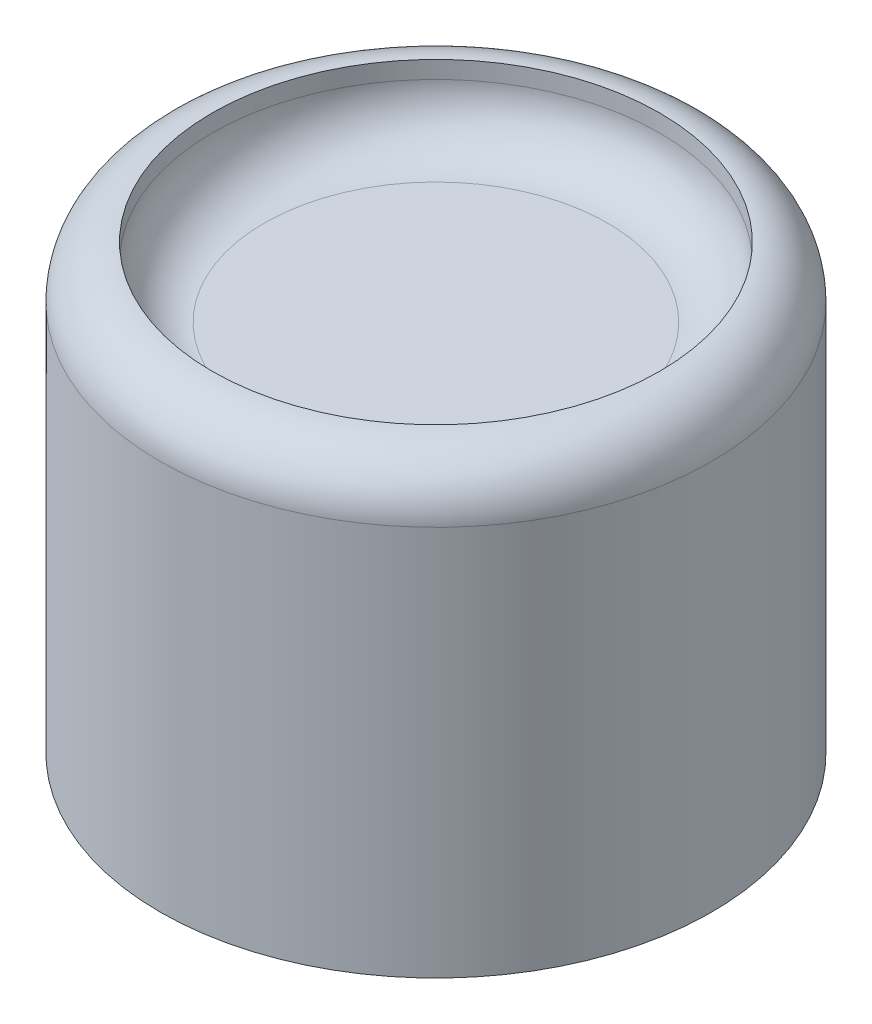
ISO-10303-21;
HEADER;
FILE_DESCRIPTION(('STEP AP214'),'2;1');
FILE_NAME('part.step','',(''),(''),'','','');
FILE_SCHEMA(('AUTOMOTIVE_DESIGN { 1 0 10303 214 1 1 1 1 }'));
ENDSEC;
DATA;
#1=APPLICATION_CONTEXT('core data for automotive mechanical design processes');
#2=APPLICATION_PROTOCOL_DEFINITION('international standard','automotive_design',2000,#1);
#3=PRODUCT_CONTEXT('',#1,'mechanical');
#4=PRODUCT('Part','Part','',(#3));
#5=PRODUCT_RELATED_PRODUCT_CATEGORY('part','',(#4));
#6=PRODUCT_DEFINITION_FORMATION('','',#4);
#7=PRODUCT_DEFINITION_CONTEXT('part definition',#1,'design');
#8=PRODUCT_DEFINITION('design','',#6,#7);
#9=PRODUCT_DEFINITION_SHAPE('','',#8);
#10=(LENGTH_UNIT() NAMED_UNIT(*) SI_UNIT(.MILLI.,.METRE.));
#11=(NAMED_UNIT(*) PLANE_ANGLE_UNIT() SI_UNIT($,.RADIAN.));
#12=(NAMED_UNIT(*) SI_UNIT($,.STERADIAN.) SOLID_ANGLE_UNIT());
#13=UNCERTAINTY_MEASURE_WITH_UNIT(LENGTH_MEASURE(1.E-05),#10,'distance_accuracy_value','');
#14=(GEOMETRIC_REPRESENTATION_CONTEXT(3) GLOBAL_UNCERTAINTY_ASSIGNED_CONTEXT((#13)) GLOBAL_UNIT_ASSIGNED_CONTEXT((#10,
#11,#12)) REPRESENTATION_CONTEXT('',''));
#15=CARTESIAN_POINT('',(0.,0.,0.));
#16=DIRECTION('',(0.,0.,1.));
#17=DIRECTION('',(1.,0.,0.));
#18=AXIS2_PLACEMENT_3D('',#15,#16,#17);
#19=CARTESIAN_POINT('',(0.,12.75,0.));
#20=DIRECTION('',(0.,-1.,0.));
#21=DIRECTION('',(0.,0.,-1.));
#22=AXIS2_PLACEMENT_3D('',#19,#20,#21);
#23=CYLINDRICAL_SURFACE('',#22,7.95);
#24=CARTESIAN_POINT('',(0.,11.25,0.));
#25=DIRECTION('',(0.,1.,0.));
#26=DIRECTION('',(0.,0.,1.));
#27=AXIS2_PLACEMENT_3D('',#24,#25,#26);
#28=CIRCLE('',#27,7.95);
#29=CARTESIAN_POINT('',(0.,11.25,7.95));
#30=VERTEX_POINT('',#29);
#31=EDGE_CURVE('E42',#30,#30,#28,.F.);
#32=ORIENTED_EDGE('',*,*,#31,.T.);
#33=EDGE_LOOP('',(#32));
#34=FACE_BOUND('',#33,.T.);
#35=CARTESIAN_POINT('',(0.,0.,0.));
#36=DIRECTION('',(0.,1.,0.));
#37=DIRECTION('',(0.,0.,1.));
#38=AXIS2_PLACEMENT_3D('',#35,#36,#37);
#39=CIRCLE('',#38,7.95);
#40=CARTESIAN_POINT('',(0.,0.,7.95));
#41=VERTEX_POINT('',#40);
#42=EDGE_CURVE('E46',#41,#41,#39,.T.);
#43=ORIENTED_EDGE('',*,*,#42,.T.);
#44=EDGE_LOOP('',(#43));
#45=FACE_BOUND('',#44,.T.);
#46=ADVANCED_FACE('F31',(#34,#45),#23,.T.);
#47=CARTESIAN_POINT('',(0.,0.,0.));
#48=DIRECTION('',(0.,1.,0.));
#49=DIRECTION('',(0.,0.,1.));
#50=AXIS2_PLACEMENT_3D('',#47,#48,#49);
#51=PLANE('',#50);
#52=ORIENTED_EDGE('',*,*,#42,.F.);
#53=EDGE_LOOP('',(#52));
#54=FACE_BOUND('',#53,.T.);
#55=ADVANCED_FACE('F59',(#54),#51,.F.);
#56=CARTESIAN_POINT('',(0.,11.25,0.));
#57=DIRECTION('',(0.,1.,0.));
#58=DIRECTION('',(0.,0.,1.));
#59=AXIS2_PLACEMENT_3D('',#56,#57,#58);
#60=TOROIDAL_SURFACE('',#59,6.45,1.5);
#61=ORIENTED_EDGE('',*,*,#31,.F.);
#62=EDGE_LOOP('',(#61));
#63=FACE_BOUND('',#62,.T.);
#64=CARTESIAN_POINT('',(0.,12.75,0.));
#65=DIRECTION('',(0.,1.,0.));
#66=DIRECTION('',(0.,0.,1.));
#67=AXIS2_PLACEMENT_3D('',#64,#65,#66);
#68=CIRCLE('',#67,6.45);
#69=CARTESIAN_POINT('',(0.,12.75,6.45));
#70=VERTEX_POINT('',#69);
#71=EDGE_CURVE('E51',#70,#70,#68,.T.);
#72=ORIENTED_EDGE('',*,*,#71,.F.);
#73=EDGE_LOOP('',(#72));
#74=FACE_BOUND('',#73,.T.);
#75=ADVANCED_FACE('F57',(#63,#74),#60,.T.);
#76=CARTESIAN_POINT('',(0.,10.75,0.));
#77=DIRECTION('',(0.,1.,0.));
#78=DIRECTION('',(0.,0.,1.));
#79=AXIS2_PLACEMENT_3D('',#76,#77,#78);
#80=CYLINDRICAL_SURFACE('',#79,6.45);
#81=CARTESIAN_POINT('',(0.,12.25,0.));
#82=DIRECTION('',(0.,1.,0.));
#83=DIRECTION('',(0.,0.,1.));
#84=AXIS2_PLACEMENT_3D('',#81,#82,#83);
#85=CIRCLE('',#84,6.45);
#86=CARTESIAN_POINT('',(0.,12.25,6.45));
#87=VERTEX_POINT('',#86);
#88=EDGE_CURVE('E10',#87,#87,#85,.F.);
#89=ORIENTED_EDGE('',*,*,#88,.T.);
#90=EDGE_LOOP('',(#89));
#91=FACE_BOUND('',#90,.T.);
#92=ORIENTED_EDGE('',*,*,#71,.T.);
#93=EDGE_LOOP('',(#92));
#94=FACE_BOUND('',#93,.T.);
#95=ADVANCED_FACE('F55',(#91,#94),#80,.F.);
#96=CARTESIAN_POINT('',(0.,10.75,0.));
#97=DIRECTION('',(0.,1.,0.));
#98=DIRECTION('',(0.,0.,1.));
#99=AXIS2_PLACEMENT_3D('',#96,#97,#98);
#100=PLANE('',#99);
#101=CARTESIAN_POINT('',(0.,10.75,0.));
#102=DIRECTION('',(0.,1.,0.));
#103=DIRECTION('',(0.,0.,1.));
#104=AXIS2_PLACEMENT_3D('',#101,#102,#103);
#105=CIRCLE('',#104,4.95);
#106=CARTESIAN_POINT('',(0.,10.75,4.95));
#107=VERTEX_POINT('',#106);
#108=EDGE_CURVE('E38',#107,#107,#105,.T.);
#109=ORIENTED_EDGE('',*,*,#108,.T.);
#110=EDGE_LOOP('',(#109));
#111=FACE_BOUND('',#110,.T.);
#112=ADVANCED_FACE('F65',(#111),#100,.T.);
#113=CARTESIAN_POINT('',(0.,12.25,0.));
#114=DIRECTION('',(0.,1.,0.));
#115=DIRECTION('',(0.,0.,1.));
#116=AXIS2_PLACEMENT_3D('',#113,#114,#115);
#117=TOROIDAL_SURFACE('',#116,4.95,1.5);
#118=ORIENTED_EDGE('',*,*,#88,.F.);
#119=EDGE_LOOP('',(#118));
#120=FACE_BOUND('',#119,.T.);
#121=ORIENTED_EDGE('',*,*,#108,.F.);
#122=EDGE_LOOP('',(#121));
#123=FACE_BOUND('',#122,.T.);
#124=ADVANCED_FACE('F33',(#120,#123),#117,.F.);
#125=CLOSED_SHELL('',(#46,#55,#75,#95,#112,#124));
#126=MANIFOLD_SOLID_BREP('B2',#125);
#127=ADVANCED_BREP_SHAPE_REPRESENTATION('',(#18,#126),#14);
#128=SHAPE_DEFINITION_REPRESENTATION(#9,#127);
ENDSEC;
END-ISO-10303-21;
